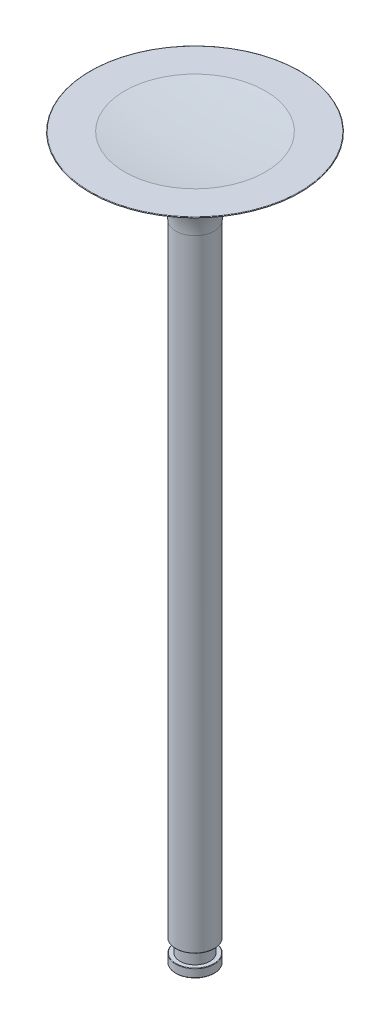
ISO-10303-21;
HEADER;
FILE_DESCRIPTION(('STEP AP214'),'2;1');
FILE_NAME('part.step','',(''),(''),'','','');
FILE_SCHEMA(('AUTOMOTIVE_DESIGN { 1 0 10303 214 1 1 1 1 }'));
ENDSEC;
DATA;
#1=APPLICATION_CONTEXT('core data for automotive mechanical design processes');
#2=APPLICATION_PROTOCOL_DEFINITION('international standard','automotive_design',2000,#1);
#3=PRODUCT_CONTEXT('',#1,'mechanical');
#4=PRODUCT('Part','Part','',(#3));
#5=PRODUCT_RELATED_PRODUCT_CATEGORY('part','',(#4));
#6=PRODUCT_DEFINITION_FORMATION('','',#4);
#7=PRODUCT_DEFINITION_CONTEXT('part definition',#1,'design');
#8=PRODUCT_DEFINITION('design','',#6,#7);
#9=PRODUCT_DEFINITION_SHAPE('','',#8);
#10=(LENGTH_UNIT() NAMED_UNIT(*) SI_UNIT(.MILLI.,.METRE.));
#11=(NAMED_UNIT(*) PLANE_ANGLE_UNIT() SI_UNIT($,.RADIAN.));
#12=(NAMED_UNIT(*) SI_UNIT($,.STERADIAN.) SOLID_ANGLE_UNIT());
#13=UNCERTAINTY_MEASURE_WITH_UNIT(LENGTH_MEASURE(1.E-05),#10,'distance_accuracy_value','');
#14=(GEOMETRIC_REPRESENTATION_CONTEXT(3) GLOBAL_UNCERTAINTY_ASSIGNED_CONTEXT((#13)) GLOBAL_UNIT_ASSIGNED_CONTEXT((#10,
#11,#12)) REPRESENTATION_CONTEXT('',''));
#15=CARTESIAN_POINT('',(0.,0.,0.));
#16=DIRECTION('',(0.,0.,1.));
#17=DIRECTION('',(1.,0.,0.));
#18=AXIS2_PLACEMENT_3D('',#15,#16,#17);
#19=CARTESIAN_POINT('',(0.,84.074,0.));
#20=DIRECTION('',(0.,-1.,0.));
#21=DIRECTION('',(0.,0.,-1.));
#22=AXIS2_PLACEMENT_3D('',#19,#20,#21);
#23=PLANE('',#22);
#24=CARTESIAN_POINT('',(0.,84.074,0.));
#25=DIRECTION('',(0.,-1.,0.));
#26=DIRECTION('',(0.,0.,-1.));
#27=AXIS2_PLACEMENT_3D('',#24,#25,#26);
#28=CIRCLE('',#27,12.2124011229669);
#29=CARTESIAN_POINT('',(0.,84.074,-12.2124011229669));
#30=VERTEX_POINT('',#29);
#31=EDGE_CURVE('E46',#30,#30,#28,.F.);
#32=ORIENTED_EDGE('',*,*,#31,.T.);
#33=EDGE_LOOP('',(#32));
#34=FACE_BOUND('',#33,.T.);
#35=CARTESIAN_POINT('',(0.,84.074,0.));
#36=DIRECTION('',(0.,-1.,0.));
#37=DIRECTION('',(0.,0.,-1.));
#38=AXIS2_PLACEMENT_3D('',#35,#36,#37);
#39=CIRCLE('',#38,8.2124011229669);
#40=CARTESIAN_POINT('',(0.,84.074,-8.2124011229669));
#41=VERTEX_POINT('',#40);
#42=EDGE_CURVE('E10',#41,#41,#39,.F.);
#43=ORIENTED_EDGE('',*,*,#42,.F.);
#44=EDGE_LOOP('',(#43));
#45=FACE_BOUND('',#44,.T.);
#46=ADVANCED_FACE('F38',(#34,#45),#23,.F.);
#47=CARTESIAN_POINT('',(-2.24999999999999,0.,0.));
#48=DIRECTION('',(0.,1.,0.));
#49=DIRECTION('',(0.,0.,1.));
#50=AXIS2_PLACEMENT_3D('',#47,#48,#49);
#51=PLANE('',#50);
#52=CARTESIAN_POINT('',(0.,0.,0.));
#53=DIRECTION('',(0.,1.,0.));
#54=DIRECTION('',(0.,0.,1.));
#55=AXIS2_PLACEMENT_3D('',#52,#53,#54);
#56=CIRCLE('',#55,2.19999999999999);
#57=CARTESIAN_POINT('',(0.,0.,2.19999999999999));
#58=VERTEX_POINT('',#57);
#59=EDGE_CURVE('E56',#58,#58,#56,.F.);
#60=ORIENTED_EDGE('',*,*,#59,.T.);
#61=EDGE_LOOP('',(#60));
#62=FACE_BOUND('',#61,.T.);
#63=ADVANCED_FACE('F110',(#62),#51,.F.);
#64=CARTESIAN_POINT('',(0.,151.267532204508,0.));
#65=DIRECTION('',(0.,0.,1.));
#66=DIRECTION('',(1.,0.,0.));
#67=AXIS2_PLACEMENT_3D('',#64,#65,#66);
#68=SPHERICAL_SURFACE('',#67,67.6935322045079);
#69=CARTESIAN_POINT('',(0.,151.267532204508,0.));
#70=DIRECTION('',(0.,-1.,0.));
#71=DIRECTION('',(0.,0.,-1.));
#72=AXIS2_PLACEMENT_3D('',#69,#70,#71);
#73=SPHERICAL_SURFACE('',#72,67.6935322045079);
#74=ORIENTED_EDGE('',*,*,#42,.T.);
#75=EDGE_LOOP('',(#74));
#76=FACE_BOUND('',#75,.T.);
#77=ADVANCED_FACE('F40',(#76),#73,.F.);
#78=CARTESIAN_POINT('',(0.,112.23564354941,0.));
#79=DIRECTION('',(0.,-1.,0.));
#80=DIRECTION('',(0.,0.,-1.));
#81=AXIS2_PLACEMENT_3D('',#78,#79,#80);
#82=DEGENERATE_TOROIDAL_SURFACE('',#81,2.25000000000001,29.9689951016722,.T.);
#83=CARTESIAN_POINT('',(0.,83.97685329027,0.));
#84=DIRECTION('',(0.,1.,0.));
#85=DIRECTION('',(0.,0.,1.));
#86=AXIS2_PLACEMENT_3D('',#83,#84,#85);
#87=CIRCLE('',#86,12.2290500797402);
#88=CARTESIAN_POINT('',(0.,83.97685329027,12.2290500797402));
#89=VERTEX_POINT('',#88);
#90=EDGE_CURVE('E52',#89,#89,#87,.F.);
#91=ORIENTED_EDGE('',*,*,#90,.T.);
#92=EDGE_LOOP('',(#91));
#93=FACE_BOUND('',#92,.T.);
#94=CARTESIAN_POINT('',(0.,82.9394178359685,0.));
#95=DIRECTION('',(0.,-1.,0.));
#96=DIRECTION('',(0.,0.,-1.));
#97=AXIS2_PLACEMENT_3D('',#94,#95,#96);
#98=CIRCLE('',#97,8.56441417323208);
#99=CARTESIAN_POINT('',(0.,82.9394178359685,-8.56441417323208));
#100=VERTEX_POINT('',#99);
#101=EDGE_CURVE('E76',#100,#100,#98,.T.);
#102=ORIENTED_EDGE('',*,*,#101,.F.);
#103=EDGE_LOOP('',(#102));
#104=FACE_BOUND('',#103,.T.);
#105=ADVANCED_FACE('F121',(#93,#104),#82,.T.);
#106=CARTESIAN_POINT('',(0.,75.1190086126223,0.));
#107=DIRECTION('',(0.,-1.,0.));
#108=DIRECTION('',(0.,0.,-1.));
#109=AXIS2_PLACEMENT_3D('',#106,#107,#108);
#110=TOROIDAL_SURFACE('',#109,10.25,8.);
#111=CARTESIAN_POINT('',(0.,75.1190086126223,0.));
#112=DIRECTION('',(0.,-1.,0.));
#113=DIRECTION('',(0.,0.,-1.));
#114=AXIS2_PLACEMENT_3D('',#111,#112,#113);
#115=CIRCLE('',#114,2.25);
#116=CARTESIAN_POINT('',(0.,75.1190086126223,-2.25));
#117=VERTEX_POINT('',#116);
#118=EDGE_CURVE('E79',#117,#117,#115,.T.);
#119=ORIENTED_EDGE('',*,*,#118,.F.);
#120=EDGE_LOOP('',(#119));
#121=FACE_BOUND('',#120,.T.);
#122=ORIENTED_EDGE('',*,*,#101,.T.);
#123=EDGE_LOOP('',(#122));
#124=FACE_BOUND('',#123,.T.);
#125=ADVANCED_FACE('F106',(#121,#124),#110,.F.);
#126=CARTESIAN_POINT('',(0.,0.,0.));
#127=DIRECTION('',(0.,-1.,0.));
#128=DIRECTION('',(0.,0.,-1.));
#129=AXIS2_PLACEMENT_3D('',#126,#127,#128);
#130=CYLINDRICAL_SURFACE('',#129,2.25);
#131=CARTESIAN_POINT('',(0.,2.55,0.));
#132=DIRECTION('',(0.,1.,0.));
#133=DIRECTION('',(0.,0.,1.));
#134=AXIS2_PLACEMENT_3D('',#131,#132,#133);
#135=CIRCLE('',#134,2.25);
#136=CARTESIAN_POINT('',(0.,2.55,2.25));
#137=VERTEX_POINT('',#136);
#138=EDGE_CURVE('E70',#137,#137,#135,.T.);
#139=ORIENTED_EDGE('',*,*,#138,.T.);
#140=EDGE_LOOP('',(#139));
#141=FACE_BOUND('',#140,.T.);
#142=ORIENTED_EDGE('',*,*,#118,.T.);
#143=EDGE_LOOP('',(#142));
#144=FACE_BOUND('',#143,.T.);
#145=ADVANCED_FACE('F99',(#141,#144),#130,.T.);
#146=CARTESIAN_POINT('',(-2.24999999999999,2.5,0.));
#147=DIRECTION('',(0.,1.,0.));
#148=DIRECTION('',(0.,0.,1.));
#149=AXIS2_PLACEMENT_3D('',#146,#147,#148);
#150=PLANE('',#149);
#151=CARTESIAN_POINT('',(0.,2.5,0.));
#152=DIRECTION('',(0.,1.,0.));
#153=DIRECTION('',(0.,0.,1.));
#154=AXIS2_PLACEMENT_3D('',#151,#152,#153);
#155=CIRCLE('',#154,2.2);
#156=CARTESIAN_POINT('',(0.,2.5,2.2));
#157=VERTEX_POINT('',#156);
#158=EDGE_CURVE('E73',#157,#157,#155,.F.);
#159=ORIENTED_EDGE('',*,*,#158,.T.);
#160=EDGE_LOOP('',(#159));
#161=FACE_BOUND('',#160,.T.);
#162=CARTESIAN_POINT('',(0.,2.5,0.));
#163=DIRECTION('',(0.,-1.,0.));
#164=DIRECTION('',(0.,0.,-1.));
#165=AXIS2_PLACEMENT_3D('',#162,#163,#164);
#166=CIRCLE('',#165,1.74999999999999);
#167=CARTESIAN_POINT('',(0.,2.5,-1.74999999999999));
#168=VERTEX_POINT('',#167);
#169=EDGE_CURVE('E82',#168,#168,#166,.T.);
#170=ORIENTED_EDGE('',*,*,#169,.F.);
#171=EDGE_LOOP('',(#170));
#172=FACE_BOUND('',#171,.T.);
#173=ADVANCED_FACE('F94',(#161,#172),#150,.F.);
#174=CARTESIAN_POINT('',(0.,0.,0.));
#175=DIRECTION('',(0.,-1.,0.));
#176=DIRECTION('',(0.,0.,-1.));
#177=AXIS2_PLACEMENT_3D('',#174,#175,#176);
#178=CYLINDRICAL_SURFACE('',#177,1.74999999999999);
#179=CARTESIAN_POINT('',(0.,1.,0.));
#180=DIRECTION('',(0.,-1.,0.));
#181=DIRECTION('',(0.,0.,-1.));
#182=AXIS2_PLACEMENT_3D('',#179,#180,#181);
#183=CIRCLE('',#182,1.74999999999999);
#184=CARTESIAN_POINT('',(0.,1.,-1.74999999999999));
#185=VERTEX_POINT('',#184);
#186=EDGE_CURVE('E85',#185,#185,#183,.T.);
#187=ORIENTED_EDGE('',*,*,#186,.F.);
#188=EDGE_LOOP('',(#187));
#189=FACE_BOUND('',#188,.T.);
#190=ORIENTED_EDGE('',*,*,#169,.T.);
#191=EDGE_LOOP('',(#190));
#192=FACE_BOUND('',#191,.T.);
#193=ADVANCED_FACE('F91',(#189,#192),#178,.T.);
#194=CARTESIAN_POINT('',(-1.74999999999999,1.,0.));
#195=DIRECTION('',(0.,-1.,0.));
#196=DIRECTION('',(0.,0.,-1.));
#197=AXIS2_PLACEMENT_3D('',#194,#195,#196);
#198=PLANE('',#197);
#199=CARTESIAN_POINT('',(0.,1.,0.));
#200=DIRECTION('',(0.,-1.,0.));
#201=DIRECTION('',(0.,0.,-1.));
#202=AXIS2_PLACEMENT_3D('',#199,#200,#201);
#203=CIRCLE('',#202,2.19999999999999);
#204=CARTESIAN_POINT('',(0.,1.,-2.19999999999999));
#205=VERTEX_POINT('',#204);
#206=EDGE_CURVE('E61',#205,#205,#203,.F.);
#207=ORIENTED_EDGE('',*,*,#206,.T.);
#208=EDGE_LOOP('',(#207));
#209=FACE_BOUND('',#208,.T.);
#210=ORIENTED_EDGE('',*,*,#186,.T.);
#211=EDGE_LOOP('',(#210));
#212=FACE_BOUND('',#211,.T.);
#213=ADVANCED_FACE('F89',(#209,#212),#198,.F.);
#214=CARTESIAN_POINT('',(0.,0.,0.));
#215=DIRECTION('',(0.,-1.,0.));
#216=DIRECTION('',(0.,0.,-1.));
#217=AXIS2_PLACEMENT_3D('',#214,#215,#216);
#218=CYLINDRICAL_SURFACE('',#217,2.24999999999999);
#219=CARTESIAN_POINT('',(0.,0.95,0.));
#220=DIRECTION('',(0.,-1.,0.));
#221=DIRECTION('',(0.,0.,-1.));
#222=AXIS2_PLACEMENT_3D('',#219,#220,#221);
#223=CIRCLE('',#222,2.24999999999999);
#224=CARTESIAN_POINT('',(0.,0.95,-2.24999999999999));
#225=VERTEX_POINT('',#224);
#226=EDGE_CURVE('E64',#225,#225,#223,.T.);
#227=ORIENTED_EDGE('',*,*,#226,.T.);
#228=EDGE_LOOP('',(#227));
#229=FACE_BOUND('',#228,.T.);
#230=CARTESIAN_POINT('',(0.,0.05,0.));
#231=DIRECTION('',(0.,1.,0.));
#232=DIRECTION('',(0.,0.,1.));
#233=AXIS2_PLACEMENT_3D('',#230,#231,#232);
#234=CIRCLE('',#233,2.24999999999999);
#235=CARTESIAN_POINT('',(0.,0.05,2.24999999999999));
#236=VERTEX_POINT('',#235);
#237=EDGE_CURVE('E67',#236,#236,#234,.T.);
#238=ORIENTED_EDGE('',*,*,#237,.T.);
#239=EDGE_LOOP('',(#238));
#240=FACE_BOUND('',#239,.T.);
#241=ADVANCED_FACE('F128',(#229,#240),#218,.T.);
#242=CARTESIAN_POINT('',(0.,2.55,0.));
#243=DIRECTION('',(0.,1.,0.));
#244=DIRECTION('',(0.,0.,1.));
#245=AXIS2_PLACEMENT_3D('',#242,#243,#244);
#246=TOROIDAL_SURFACE('',#245,2.2,0.05);
#247=ORIENTED_EDGE('',*,*,#138,.F.);
#248=EDGE_LOOP('',(#247));
#249=FACE_BOUND('',#248,.T.);
#250=ORIENTED_EDGE('',*,*,#158,.F.);
#251=EDGE_LOOP('',(#250));
#252=FACE_BOUND('',#251,.T.);
#253=ADVANCED_FACE('F124',(#249,#252),#246,.T.);
#254=CARTESIAN_POINT('',(0.,0.95,0.));
#255=DIRECTION('',(0.,-1.,0.));
#256=DIRECTION('',(0.,0.,-1.));
#257=AXIS2_PLACEMENT_3D('',#254,#255,#256);
#258=TOROIDAL_SURFACE('',#257,2.19999999999999,0.05);
#259=ORIENTED_EDGE('',*,*,#206,.F.);
#260=EDGE_LOOP('',(#259));
#261=FACE_BOUND('',#260,.T.);
#262=ORIENTED_EDGE('',*,*,#226,.F.);
#263=EDGE_LOOP('',(#262));
#264=FACE_BOUND('',#263,.T.);
#265=ADVANCED_FACE('F127',(#261,#264),#258,.T.);
#266=CARTESIAN_POINT('',(0.,0.05,0.));
#267=DIRECTION('',(0.,1.,0.));
#268=DIRECTION('',(0.,0.,1.));
#269=AXIS2_PLACEMENT_3D('',#266,#267,#268);
#270=TOROIDAL_SURFACE('',#269,2.19999999999999,0.05);
#271=ORIENTED_EDGE('',*,*,#237,.F.);
#272=EDGE_LOOP('',(#271));
#273=FACE_BOUND('',#272,.T.);
#274=ORIENTED_EDGE('',*,*,#59,.F.);
#275=EDGE_LOOP('',(#274));
#276=FACE_BOUND('',#275,.T.);
#277=ADVANCED_FACE('F132',(#273,#276),#270,.T.);
#278=CARTESIAN_POINT('',(0.,84.024,0.));
#279=DIRECTION('',(0.,-1.,0.));
#280=DIRECTION('',(0.,0.,-1.));
#281=AXIS2_PLACEMENT_3D('',#278,#279,#280);
#282=TOROIDAL_SURFACE('',#281,12.2124011229669,0.05);
#283=ORIENTED_EDGE('',*,*,#31,.F.);
#284=EDGE_LOOP('',(#283));
#285=FACE_BOUND('',#284,.T.);
#286=ORIENTED_EDGE('',*,*,#90,.F.);
#287=EDGE_LOOP('',(#286));
#288=FACE_BOUND('',#287,.T.);
#289=ADVANCED_FACE('F135',(#285,#288),#282,.T.);
#290=CLOSED_SHELL('',(#46,#63,#77,#105,#125,#145,#173,#193,#213,#241,#253,#265,#277,#289));
#291=MANIFOLD_SOLID_BREP('B2',#290);
#292=ADVANCED_BREP_SHAPE_REPRESENTATION('',(#18,#291),#14);
#293=SHAPE_DEFINITION_REPRESENTATION(#9,#292);
ENDSEC;
END-ISO-10303-21;
